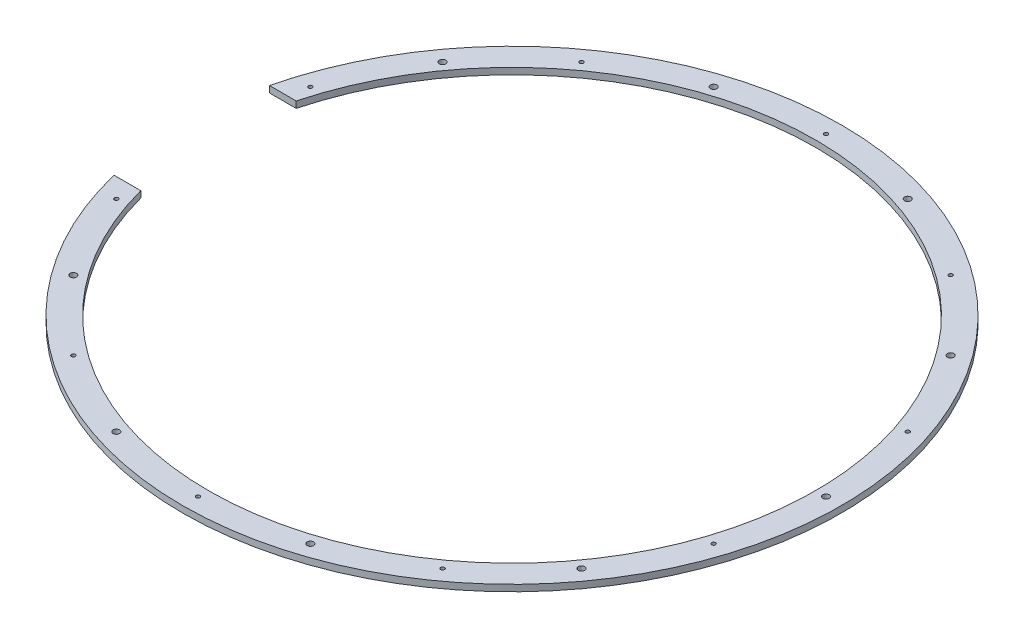
ISO-10303-21;
HEADER;
FILE_DESCRIPTION(('STEP AP214'),'2;1');
FILE_NAME('part.step','',(''),(''),'','','');
FILE_SCHEMA(('AUTOMOTIVE_DESIGN { 1 0 10303 214 1 1 1 1 }'));
ENDSEC;
DATA;
#1=APPLICATION_CONTEXT('core data for automotive mechanical design processes');
#2=APPLICATION_PROTOCOL_DEFINITION('international standard','automotive_design',2000,#1);
#3=PRODUCT_CONTEXT('',#1,'mechanical');
#4=PRODUCT('Part','Part','',(#3));
#5=PRODUCT_RELATED_PRODUCT_CATEGORY('part','',(#4));
#6=PRODUCT_DEFINITION_FORMATION('','',#4);
#7=PRODUCT_DEFINITION_CONTEXT('part definition',#1,'design');
#8=PRODUCT_DEFINITION('design','',#6,#7);
#9=PRODUCT_DEFINITION_SHAPE('','',#8);
#10=(LENGTH_UNIT() NAMED_UNIT(*) SI_UNIT(.MILLI.,.METRE.));
#11=(NAMED_UNIT(*) PLANE_ANGLE_UNIT() SI_UNIT($,.RADIAN.));
#12=(NAMED_UNIT(*) SI_UNIT($,.STERADIAN.) SOLID_ANGLE_UNIT());
#13=UNCERTAINTY_MEASURE_WITH_UNIT(LENGTH_MEASURE(1.E-05),#10,'distance_accuracy_value','');
#14=(GEOMETRIC_REPRESENTATION_CONTEXT(3) GLOBAL_UNCERTAINTY_ASSIGNED_CONTEXT((#13)) GLOBAL_UNIT_ASSIGNED_CONTEXT((#10,
#11,#12)) REPRESENTATION_CONTEXT('',''));
#15=CARTESIAN_POINT('',(0.,0.,0.));
#16=DIRECTION('',(0.,0.,1.));
#17=DIRECTION('',(1.,0.,0.));
#18=AXIS2_PLACEMENT_3D('',#15,#16,#17);
#19=CARTESIAN_POINT('',(0.,5.,0.));
#20=DIRECTION('',(0.,1.,0.));
#21=DIRECTION('',(0.,0.,1.));
#22=AXIS2_PLACEMENT_3D('',#19,#20,#21);
#23=PLANE('',#22);
#24=CARTESIAN_POINT('',(1.32132478297511E-11,5.,242.50000000001));
#25=DIRECTION('',(0.,1.,0.));
#26=DIRECTION('',(0.,0.,1.));
#27=AXIS2_PLACEMENT_3D('',#24,#25,#26);
#28=CIRCLE('',#27,1.49999999999059);
#29=CARTESIAN_POINT('',(1.32132478297511E-11,5.,244.));
#30=VERTEX_POINT('',#29);
#31=EDGE_CURVE('E205',#30,#30,#28,.T.);
#32=ORIENTED_EDGE('',*,*,#31,.F.);
#33=EDGE_LOOP('',(#32));
#34=FACE_BOUND('',#33,.T.);
#35=CARTESIAN_POINT('',(142.537923680936,5.,196.186621135929));
#36=DIRECTION('',(0.,1.,0.));
#37=DIRECTION('',(0.,0.,1.));
#38=AXIS2_PLACEMENT_3D('',#35,#36,#37);
#39=CIRCLE('',#38,1.4999999999906);
#40=CARTESIAN_POINT('',(142.537923680936,5.,197.686621135919));
#41=VERTEX_POINT('',#40);
#42=EDGE_CURVE('E160',#41,#41,#39,.T.);
#43=ORIENTED_EDGE('',*,*,#42,.F.);
#44=EDGE_LOOP('',(#43));
#45=FACE_BOUND('',#44,.T.);
#46=CARTESIAN_POINT('',(230.631205201581,5.,74.9366211359248));
#47=DIRECTION('',(0.,1.,0.));
#48=DIRECTION('',(0.,0.,1.));
#49=AXIS2_PLACEMENT_3D('',#46,#47,#48);
#50=CIRCLE('',#49,1.49999999999414);
#51=CARTESIAN_POINT('',(230.631205201581,5.,76.4366211359189));
#52=VERTEX_POINT('',#51);
#53=EDGE_CURVE('E159',#52,#52,#50,.T.);
#54=ORIENTED_EDGE('',*,*,#53,.F.);
#55=EDGE_LOOP('',(#54));
#56=FACE_BOUND('',#55,.T.);
#57=CARTESIAN_POINT('',(230.631205201575,5.,-74.9366211359248));
#58=DIRECTION('',(0.,1.,0.));
#59=DIRECTION('',(0.,0.,1.));
#60=AXIS2_PLACEMENT_3D('',#57,#58,#59);
#61=CIRCLE('',#60,1.5);
#62=CARTESIAN_POINT('',(230.631205201575,5.,-73.4366211359248));
#63=VERTEX_POINT('',#62);
#64=EDGE_CURVE('E166',#63,#63,#61,.T.);
#65=ORIENTED_EDGE('',*,*,#64,.F.);
#66=EDGE_LOOP('',(#65));
#67=FACE_BOUND('',#66,.T.);
#68=CARTESIAN_POINT('',(142.53792368092,5.,-196.186621135921));
#69=DIRECTION('',(0.,1.,0.));
#70=DIRECTION('',(0.,0.,1.));
#71=AXIS2_PLACEMENT_3D('',#68,#69,#70);
#72=CIRCLE('',#71,1.50000000000597);
#73=CARTESIAN_POINT('',(142.53792368092,5.,-194.686621135915));
#74=VERTEX_POINT('',#73);
#75=EDGE_CURVE('E172',#74,#74,#72,.T.);
#76=ORIENTED_EDGE('',*,*,#75,.F.);
#77=EDGE_LOOP('',(#76));
#78=FACE_BOUND('',#77,.T.);
#79=CARTESIAN_POINT('',(-7.07926561869708E-12,5.,-242.499999999991));
#80=DIRECTION('',(0.,1.,0.));
#81=DIRECTION('',(0.,0.,1.));
#82=AXIS2_PLACEMENT_3D('',#79,#80,#81);
#83=CIRCLE('',#82,1.50000000000972);
#84=CARTESIAN_POINT('',(-7.07926561869708E-12,5.,-240.999999999981));
#85=VERTEX_POINT('',#84);
#86=EDGE_CURVE('E178',#85,#85,#83,.T.);
#87=ORIENTED_EDGE('',*,*,#86,.F.);
#88=EDGE_LOOP('',(#87));
#89=FACE_BOUND('',#88,.T.);
#90=CARTESIAN_POINT('',(-142.53792368093,5.,-196.186621135909));
#91=DIRECTION('',(0.,1.,0.));
#92=DIRECTION('',(0.,0.,1.));
#93=AXIS2_PLACEMENT_3D('',#90,#91,#92);
#94=CIRCLE('',#93,1.50000000000975);
#95=CARTESIAN_POINT('',(-142.53792368093,5.,-194.6866211359));
#96=VERTEX_POINT('',#95);
#97=EDGE_CURVE('E184',#96,#96,#94,.T.);
#98=ORIENTED_EDGE('',*,*,#97,.F.);
#99=EDGE_LOOP('',(#98));
#100=FACE_BOUND('',#99,.T.);
#101=CARTESIAN_POINT('',(-230.631205201575,5.,-74.9366211359056));
#102=DIRECTION('',(0.,1.,0.));
#103=DIRECTION('',(0.,0.,1.));
#104=AXIS2_PLACEMENT_3D('',#101,#102,#103);
#105=CIRCLE('',#104,1.50000000000615);
#106=CARTESIAN_POINT('',(-230.631205201575,5.,-73.4366211358995));
#107=VERTEX_POINT('',#106);
#108=EDGE_CURVE('E190',#107,#107,#105,.T.);
#109=ORIENTED_EDGE('',*,*,#108,.F.);
#110=EDGE_LOOP('',(#109));
#111=FACE_BOUND('',#110,.T.);
#112=CARTESIAN_POINT('',(-230.631205201569,5.,74.936621135944));
#113=DIRECTION('',(0.,1.,0.));
#114=DIRECTION('',(0.,0.,1.));
#115=AXIS2_PLACEMENT_3D('',#112,#113,#114);
#116=CIRCLE('',#115,1.50000000000033);
#117=CARTESIAN_POINT('',(-230.631205201569,5.,76.4366211359443));
#118=VERTEX_POINT('',#117);
#119=EDGE_CURVE('E196',#118,#118,#116,.T.);
#120=ORIENTED_EDGE('',*,*,#119,.F.);
#121=EDGE_LOOP('',(#120));
#122=FACE_BOUND('',#121,.T.);
#123=CARTESIAN_POINT('',(-142.537923680914,5.,196.18662113594));
#124=DIRECTION('',(0.,1.,0.));
#125=DIRECTION('',(0.,0.,1.));
#126=AXIS2_PLACEMENT_3D('',#123,#124,#125);
#127=CIRCLE('',#126,1.49999999999442);
#128=CARTESIAN_POINT('',(-142.537923680914,5.,197.686621135935));
#129=VERTEX_POINT('',#128);
#130=EDGE_CURVE('E202',#129,#129,#127,.T.);
#131=ORIENTED_EDGE('',*,*,#130,.F.);
#132=EDGE_LOOP('',(#131));
#133=FACE_BOUND('',#132,.T.);
#134=CARTESIAN_POINT('',(242.5,5.,0.));
#135=DIRECTION('',(0.,1.,0.));
#136=DIRECTION('',(0.,0.,1.));
#137=AXIS2_PLACEMENT_3D('',#134,#135,#136);
#138=CIRCLE('',#137,2.5);
#139=CARTESIAN_POINT('',(242.5,5.,2.5));
#140=VERTEX_POINT('',#139);
#141=EDGE_CURVE('E145',#140,#140,#138,.T.);
#142=ORIENTED_EDGE('',*,*,#141,.F.);
#143=EDGE_LOOP('',(#142));
#144=FACE_BOUND('',#143,.T.);
#145=CARTESIAN_POINT('',(196.186621135925,5.,-142.537923680925));
#146=DIRECTION('',(0.,1.,0.));
#147=DIRECTION('',(0.,0.,1.));
#148=AXIS2_PLACEMENT_3D('',#145,#146,#147);
#149=CIRCLE('',#148,2.5);
#150=CARTESIAN_POINT('',(196.186621135925,5.,-140.037923680925));
#151=VERTEX_POINT('',#150);
#152=EDGE_CURVE('E146',#151,#151,#149,.T.);
#153=ORIENTED_EDGE('',*,*,#152,.F.);
#154=EDGE_LOOP('',(#153));
#155=FACE_BOUND('',#154,.T.);
#156=CARTESIAN_POINT('',(74.9366211359247,5.,-230.631205201575));
#157=DIRECTION('',(0.,1.,0.));
#158=DIRECTION('',(0.,0.,1.));
#159=AXIS2_PLACEMENT_3D('',#156,#157,#158);
#160=CIRCLE('',#159,2.50000000000001);
#161=CARTESIAN_POINT('',(74.9366211359247,5.,-228.131205201575));
#162=VERTEX_POINT('',#161);
#163=EDGE_CURVE('E102',#162,#162,#160,.T.);
#164=ORIENTED_EDGE('',*,*,#163,.F.);
#165=EDGE_LOOP('',(#164));
#166=FACE_BOUND('',#165,.T.);
#167=CARTESIAN_POINT('',(-74.9366211359248,5.,-230.631205201575));
#168=DIRECTION('',(0.,1.,0.));
#169=DIRECTION('',(0.,0.,1.));
#170=AXIS2_PLACEMENT_3D('',#167,#168,#169);
#171=CIRCLE('',#170,2.5);
#172=CARTESIAN_POINT('',(-74.9366211359248,5.,-228.131205201575));
#173=VERTEX_POINT('',#172);
#174=EDGE_CURVE('E109',#173,#173,#171,.T.);
#175=ORIENTED_EDGE('',*,*,#174,.F.);
#176=EDGE_LOOP('',(#175));
#177=FACE_BOUND('',#176,.T.);
#178=CARTESIAN_POINT('',(-196.186621135925,5.,-142.537923680925));
#179=DIRECTION('',(0.,1.,0.));
#180=DIRECTION('',(0.,0.,1.));
#181=AXIS2_PLACEMENT_3D('',#178,#179,#180);
#182=CIRCLE('',#181,2.5);
#183=CARTESIAN_POINT('',(-196.186621135925,5.,-140.037923680925));
#184=VERTEX_POINT('',#183);
#185=EDGE_CURVE('E115',#184,#184,#182,.T.);
#186=ORIENTED_EDGE('',*,*,#185,.F.);
#187=EDGE_LOOP('',(#186));
#188=FACE_BOUND('',#187,.T.);
#189=CARTESIAN_POINT('',(-196.186621135925,5.,142.537923680925));
#190=DIRECTION('',(0.,1.,0.));
#191=DIRECTION('',(0.,0.,1.));
#192=AXIS2_PLACEMENT_3D('',#189,#190,#191);
#193=CIRCLE('',#192,2.5);
#194=CARTESIAN_POINT('',(-196.186621135925,5.,145.037923680925));
#195=VERTEX_POINT('',#194);
#196=EDGE_CURVE('E121',#195,#195,#193,.T.);
#197=ORIENTED_EDGE('',*,*,#196,.F.);
#198=EDGE_LOOP('',(#197));
#199=FACE_BOUND('',#198,.T.);
#200=CARTESIAN_POINT('',(-74.9366211359248,5.,230.631205201575));
#201=DIRECTION('',(0.,1.,0.));
#202=DIRECTION('',(0.,0.,1.));
#203=AXIS2_PLACEMENT_3D('',#200,#201,#202);
#204=CIRCLE('',#203,2.5);
#205=CARTESIAN_POINT('',(-74.9366211359248,5.,233.131205201575));
#206=VERTEX_POINT('',#205);
#207=EDGE_CURVE('E127',#206,#206,#204,.T.);
#208=ORIENTED_EDGE('',*,*,#207,.F.);
#209=EDGE_LOOP('',(#208));
#210=FACE_BOUND('',#209,.T.);
#211=CARTESIAN_POINT('',(74.9366211359247,5.,230.631205201575));
#212=DIRECTION('',(0.,1.,0.));
#213=DIRECTION('',(0.,0.,1.));
#214=AXIS2_PLACEMENT_3D('',#211,#212,#213);
#215=CIRCLE('',#214,2.49999999999998);
#216=CARTESIAN_POINT('',(74.9366211359247,5.,233.131205201575));
#217=VERTEX_POINT('',#216);
#218=EDGE_CURVE('E133',#217,#217,#215,.T.);
#219=ORIENTED_EDGE('',*,*,#218,.F.);
#220=EDGE_LOOP('',(#219));
#221=FACE_BOUND('',#220,.T.);
#222=CARTESIAN_POINT('',(196.186621135925,5.,142.537923680925));
#223=DIRECTION('',(0.,1.,0.));
#224=DIRECTION('',(0.,0.,1.));
#225=AXIS2_PLACEMENT_3D('',#222,#223,#224);
#226=CIRCLE('',#225,2.50000000000002);
#227=CARTESIAN_POINT('',(196.186621135925,5.,145.037923680925));
#228=VERTEX_POINT('',#227);
#229=EDGE_CURVE('E139',#228,#228,#226,.T.);
#230=ORIENTED_EDGE('',*,*,#229,.F.);
#231=EDGE_LOOP('',(#230));
#232=FACE_BOUND('',#231,.T.);
#233=CARTESIAN_POINT('',(0.,5.,0.));
#234=DIRECTION('',(0.,1.,0.));
#235=DIRECTION('',(0.,0.,1.));
#236=AXIS2_PLACEMENT_3D('',#233,#234,#235);
#237=CIRCLE('',#236,234.5);
#238=CARTESIAN_POINT('',(-226.694177252086,5.,60.));
#239=VERTEX_POINT('',#238);
#240=CARTESIAN_POINT('',(-226.694177252086,5.,-60.));
#241=VERTEX_POINT('',#240);
#242=EDGE_CURVE('E86',#239,#241,#237,.T.);
#243=ORIENTED_EDGE('',*,*,#242,.F.);
#244=DIRECTION('',(-1.,0.,0.));
#245=VECTOR('',#244,1.);
#246=CARTESIAN_POINT('',(-226.694177252086,5.,60.));
#247=LINE('',#246,#245);
#248=CARTESIAN_POINT('',(-247.326201604278,5.,60.));
#249=VERTEX_POINT('',#248);
#250=EDGE_CURVE('E47',#239,#249,#247,.T.);
#251=ORIENTED_EDGE('',*,*,#250,.T.);
#252=CARTESIAN_POINT('',(0.,5.,0.));
#253=DIRECTION('',(0.,1.,0.));
#254=DIRECTION('',(0.,0.,1.));
#255=AXIS2_PLACEMENT_3D('',#252,#253,#254);
#256=CIRCLE('',#255,254.5);
#257=CARTESIAN_POINT('',(-247.326201604278,5.,-60.));
#258=VERTEX_POINT('',#257);
#259=EDGE_CURVE('E11',#249,#258,#256,.T.);
#260=ORIENTED_EDGE('',*,*,#259,.T.);
#261=DIRECTION('',(-1.,0.,0.));
#262=VECTOR('',#261,1.);
#263=CARTESIAN_POINT('',(-226.694177252086,5.,-60.));
#264=LINE('',#263,#262);
#265=EDGE_CURVE('E95',#241,#258,#264,.T.);
#266=ORIENTED_EDGE('',*,*,#265,.F.);
#267=EDGE_LOOP('',(#243,#251,#260,#266));
#268=FACE_BOUND('',#267,.T.);
#269=ADVANCED_FACE('F32',(#34,#45,#56,#67,#78,#89,#100,#111,#122,#133,#144,#155,#166,#177,#188,
#199,#210,#221,#232,#268),#23,.T.);
#270=CARTESIAN_POINT('',(0.,0.,0.));
#271=DIRECTION('',(0.,1.,0.));
#272=DIRECTION('',(0.,0.,1.));
#273=AXIS2_PLACEMENT_3D('',#270,#271,#272);
#274=PLANE('',#273);
#275=CARTESIAN_POINT('',(1.32132478297511E-11,0.,242.50000000001));
#276=DIRECTION('',(0.,1.,0.));
#277=DIRECTION('',(0.,0.,1.));
#278=AXIS2_PLACEMENT_3D('',#275,#276,#277);
#279=CIRCLE('',#278,1.49999999999059);
#280=CARTESIAN_POINT('',(1.32132478297511E-11,0.,244.));
#281=VERTEX_POINT('',#280);
#282=EDGE_CURVE('E149',#281,#281,#279,.T.);
#283=ORIENTED_EDGE('',*,*,#282,.T.);
#284=EDGE_LOOP('',(#283));
#285=FACE_BOUND('',#284,.T.);
#286=CARTESIAN_POINT('',(142.537923680936,0.,196.186621135929));
#287=DIRECTION('',(0.,1.,0.));
#288=DIRECTION('',(0.,0.,1.));
#289=AXIS2_PLACEMENT_3D('',#286,#287,#288);
#290=CIRCLE('',#289,1.4999999999906);
#291=CARTESIAN_POINT('',(142.537923680936,0.,197.686621135919));
#292=VERTEX_POINT('',#291);
#293=EDGE_CURVE('E206',#292,#292,#290,.T.);
#294=ORIENTED_EDGE('',*,*,#293,.T.);
#295=EDGE_LOOP('',(#294));
#296=FACE_BOUND('',#295,.T.);
#297=CARTESIAN_POINT('',(230.631205201581,0.,74.9366211359248));
#298=DIRECTION('',(0.,1.,0.));
#299=DIRECTION('',(0.,0.,1.));
#300=AXIS2_PLACEMENT_3D('',#297,#298,#299);
#301=CIRCLE('',#300,1.49999999999414);
#302=CARTESIAN_POINT('',(230.631205201581,0.,76.4366211359189));
#303=VERTEX_POINT('',#302);
#304=EDGE_CURVE('E156',#303,#303,#301,.T.);
#305=ORIENTED_EDGE('',*,*,#304,.T.);
#306=EDGE_LOOP('',(#305));
#307=FACE_BOUND('',#306,.T.);
#308=CARTESIAN_POINT('',(230.631205201575,0.,-74.9366211359248));
#309=DIRECTION('',(0.,1.,0.));
#310=DIRECTION('',(0.,0.,1.));
#311=AXIS2_PLACEMENT_3D('',#308,#309,#310);
#312=CIRCLE('',#311,1.5);
#313=CARTESIAN_POINT('',(230.631205201575,0.,-73.4366211359248));
#314=VERTEX_POINT('',#313);
#315=EDGE_CURVE('E163',#314,#314,#312,.T.);
#316=ORIENTED_EDGE('',*,*,#315,.T.);
#317=EDGE_LOOP('',(#316));
#318=FACE_BOUND('',#317,.T.);
#319=CARTESIAN_POINT('',(142.53792368092,0.,-196.186621135921));
#320=DIRECTION('',(0.,1.,0.));
#321=DIRECTION('',(0.,0.,1.));
#322=AXIS2_PLACEMENT_3D('',#319,#320,#321);
#323=CIRCLE('',#322,1.50000000000597);
#324=CARTESIAN_POINT('',(142.53792368092,0.,-194.686621135915));
#325=VERTEX_POINT('',#324);
#326=EDGE_CURVE('E169',#325,#325,#323,.T.);
#327=ORIENTED_EDGE('',*,*,#326,.T.);
#328=EDGE_LOOP('',(#327));
#329=FACE_BOUND('',#328,.T.);
#330=CARTESIAN_POINT('',(-7.07926561869708E-12,0.,-242.499999999991));
#331=DIRECTION('',(0.,1.,0.));
#332=DIRECTION('',(0.,0.,1.));
#333=AXIS2_PLACEMENT_3D('',#330,#331,#332);
#334=CIRCLE('',#333,1.50000000000972);
#335=CARTESIAN_POINT('',(-7.07926561869708E-12,0.,-240.999999999981));
#336=VERTEX_POINT('',#335);
#337=EDGE_CURVE('E175',#336,#336,#334,.T.);
#338=ORIENTED_EDGE('',*,*,#337,.T.);
#339=EDGE_LOOP('',(#338));
#340=FACE_BOUND('',#339,.T.);
#341=CARTESIAN_POINT('',(-142.53792368093,0.,-196.186621135909));
#342=DIRECTION('',(0.,1.,0.));
#343=DIRECTION('',(0.,0.,1.));
#344=AXIS2_PLACEMENT_3D('',#341,#342,#343);
#345=CIRCLE('',#344,1.50000000000975);
#346=CARTESIAN_POINT('',(-142.53792368093,0.,-194.6866211359));
#347=VERTEX_POINT('',#346);
#348=EDGE_CURVE('E181',#347,#347,#345,.T.);
#349=ORIENTED_EDGE('',*,*,#348,.T.);
#350=EDGE_LOOP('',(#349));
#351=FACE_BOUND('',#350,.T.);
#352=CARTESIAN_POINT('',(-230.631205201575,0.,-74.9366211359056));
#353=DIRECTION('',(0.,1.,0.));
#354=DIRECTION('',(0.,0.,1.));
#355=AXIS2_PLACEMENT_3D('',#352,#353,#354);
#356=CIRCLE('',#355,1.50000000000615);
#357=CARTESIAN_POINT('',(-230.631205201575,0.,-73.4366211358995));
#358=VERTEX_POINT('',#357);
#359=EDGE_CURVE('E187',#358,#358,#356,.T.);
#360=ORIENTED_EDGE('',*,*,#359,.T.);
#361=EDGE_LOOP('',(#360));
#362=FACE_BOUND('',#361,.T.);
#363=CARTESIAN_POINT('',(-230.631205201569,0.,74.936621135944));
#364=DIRECTION('',(0.,1.,0.));
#365=DIRECTION('',(0.,0.,1.));
#366=AXIS2_PLACEMENT_3D('',#363,#364,#365);
#367=CIRCLE('',#366,1.50000000000033);
#368=CARTESIAN_POINT('',(-230.631205201569,0.,76.4366211359443));
#369=VERTEX_POINT('',#368);
#370=EDGE_CURVE('E193',#369,#369,#367,.T.);
#371=ORIENTED_EDGE('',*,*,#370,.T.);
#372=EDGE_LOOP('',(#371));
#373=FACE_BOUND('',#372,.T.);
#374=CARTESIAN_POINT('',(-142.537923680914,0.,196.18662113594));
#375=DIRECTION('',(0.,1.,0.));
#376=DIRECTION('',(0.,0.,1.));
#377=AXIS2_PLACEMENT_3D('',#374,#375,#376);
#378=CIRCLE('',#377,1.49999999999442);
#379=CARTESIAN_POINT('',(-142.537923680914,0.,197.686621135935));
#380=VERTEX_POINT('',#379);
#381=EDGE_CURVE('E199',#380,#380,#378,.T.);
#382=ORIENTED_EDGE('',*,*,#381,.T.);
#383=EDGE_LOOP('',(#382));
#384=FACE_BOUND('',#383,.T.);
#385=CARTESIAN_POINT('',(242.5,0.,0.));
#386=DIRECTION('',(0.,1.,0.));
#387=DIRECTION('',(0.,0.,1.));
#388=AXIS2_PLACEMENT_3D('',#385,#386,#387);
#389=CIRCLE('',#388,2.5);
#390=CARTESIAN_POINT('',(242.5,0.,2.5));
#391=VERTEX_POINT('',#390);
#392=EDGE_CURVE('E100',#391,#391,#389,.T.);
#393=ORIENTED_EDGE('',*,*,#392,.T.);
#394=EDGE_LOOP('',(#393));
#395=FACE_BOUND('',#394,.T.);
#396=CARTESIAN_POINT('',(196.186621135925,0.,-142.537923680925));
#397=DIRECTION('',(0.,1.,0.));
#398=DIRECTION('',(0.,0.,1.));
#399=AXIS2_PLACEMENT_3D('',#396,#397,#398);
#400=CIRCLE('',#399,2.5);
#401=CARTESIAN_POINT('',(196.186621135925,0.,-140.037923680925));
#402=VERTEX_POINT('',#401);
#403=EDGE_CURVE('E106',#402,#402,#400,.T.);
#404=ORIENTED_EDGE('',*,*,#403,.T.);
#405=EDGE_LOOP('',(#404));
#406=FACE_BOUND('',#405,.T.);
#407=CARTESIAN_POINT('',(74.9366211359247,0.,-230.631205201575));
#408=DIRECTION('',(0.,1.,0.));
#409=DIRECTION('',(0.,0.,1.));
#410=AXIS2_PLACEMENT_3D('',#407,#408,#409);
#411=CIRCLE('',#410,2.50000000000001);
#412=CARTESIAN_POINT('',(74.9366211359247,0.,-228.131205201575));
#413=VERTEX_POINT('',#412);
#414=EDGE_CURVE('E105',#413,#413,#411,.T.);
#415=ORIENTED_EDGE('',*,*,#414,.T.);
#416=EDGE_LOOP('',(#415));
#417=FACE_BOUND('',#416,.T.);
#418=CARTESIAN_POINT('',(-74.9366211359248,0.,-230.631205201575));
#419=DIRECTION('',(0.,1.,0.));
#420=DIRECTION('',(0.,0.,1.));
#421=AXIS2_PLACEMENT_3D('',#418,#419,#420);
#422=CIRCLE('',#421,2.5);
#423=CARTESIAN_POINT('',(-74.9366211359248,0.,-228.131205201575));
#424=VERTEX_POINT('',#423);
#425=EDGE_CURVE('E112',#424,#424,#422,.T.);
#426=ORIENTED_EDGE('',*,*,#425,.T.);
#427=EDGE_LOOP('',(#426));
#428=FACE_BOUND('',#427,.T.);
#429=CARTESIAN_POINT('',(-196.186621135925,0.,-142.537923680925));
#430=DIRECTION('',(0.,1.,0.));
#431=DIRECTION('',(0.,0.,1.));
#432=AXIS2_PLACEMENT_3D('',#429,#430,#431);
#433=CIRCLE('',#432,2.5);
#434=CARTESIAN_POINT('',(-196.186621135925,0.,-140.037923680925));
#435=VERTEX_POINT('',#434);
#436=EDGE_CURVE('E118',#435,#435,#433,.T.);
#437=ORIENTED_EDGE('',*,*,#436,.T.);
#438=EDGE_LOOP('',(#437));
#439=FACE_BOUND('',#438,.T.);
#440=CARTESIAN_POINT('',(-196.186621135925,0.,142.537923680925));
#441=DIRECTION('',(0.,1.,0.));
#442=DIRECTION('',(0.,0.,1.));
#443=AXIS2_PLACEMENT_3D('',#440,#441,#442);
#444=CIRCLE('',#443,2.5);
#445=CARTESIAN_POINT('',(-196.186621135925,0.,145.037923680925));
#446=VERTEX_POINT('',#445);
#447=EDGE_CURVE('E124',#446,#446,#444,.T.);
#448=ORIENTED_EDGE('',*,*,#447,.T.);
#449=EDGE_LOOP('',(#448));
#450=FACE_BOUND('',#449,.T.);
#451=CARTESIAN_POINT('',(-74.9366211359248,0.,230.631205201575));
#452=DIRECTION('',(0.,1.,0.));
#453=DIRECTION('',(0.,0.,1.));
#454=AXIS2_PLACEMENT_3D('',#451,#452,#453);
#455=CIRCLE('',#454,2.5);
#456=CARTESIAN_POINT('',(-74.9366211359248,0.,233.131205201575));
#457=VERTEX_POINT('',#456);
#458=EDGE_CURVE('E130',#457,#457,#455,.T.);
#459=ORIENTED_EDGE('',*,*,#458,.T.);
#460=EDGE_LOOP('',(#459));
#461=FACE_BOUND('',#460,.T.);
#462=CARTESIAN_POINT('',(74.9366211359247,0.,230.631205201575));
#463=DIRECTION('',(0.,1.,0.));
#464=DIRECTION('',(0.,0.,1.));
#465=AXIS2_PLACEMENT_3D('',#462,#463,#464);
#466=CIRCLE('',#465,2.49999999999998);
#467=CARTESIAN_POINT('',(74.9366211359247,0.,233.131205201575));
#468=VERTEX_POINT('',#467);
#469=EDGE_CURVE('E136',#468,#468,#466,.T.);
#470=ORIENTED_EDGE('',*,*,#469,.T.);
#471=EDGE_LOOP('',(#470));
#472=FACE_BOUND('',#471,.T.);
#473=CARTESIAN_POINT('',(196.186621135925,0.,142.537923680925));
#474=DIRECTION('',(0.,1.,0.));
#475=DIRECTION('',(0.,0.,1.));
#476=AXIS2_PLACEMENT_3D('',#473,#474,#475);
#477=CIRCLE('',#476,2.50000000000002);
#478=CARTESIAN_POINT('',(196.186621135925,0.,145.037923680925));
#479=VERTEX_POINT('',#478);
#480=EDGE_CURVE('E142',#479,#479,#477,.T.);
#481=ORIENTED_EDGE('',*,*,#480,.T.);
#482=EDGE_LOOP('',(#481));
#483=FACE_BOUND('',#482,.T.);
#484=DIRECTION('',(-1.,0.,0.));
#485=VECTOR('',#484,1.);
#486=CARTESIAN_POINT('',(-226.694177252086,0.,60.));
#487=LINE('',#486,#485);
#488=CARTESIAN_POINT('',(-226.694177252086,0.,60.));
#489=VERTEX_POINT('',#488);
#490=CARTESIAN_POINT('',(-247.326201604278,0.,60.));
#491=VERTEX_POINT('',#490);
#492=EDGE_CURVE('E73',#489,#491,#487,.T.);
#493=ORIENTED_EDGE('',*,*,#492,.F.);
#494=CARTESIAN_POINT('',(0.,0.,0.));
#495=DIRECTION('',(0.,1.,0.));
#496=DIRECTION('',(0.,0.,1.));
#497=AXIS2_PLACEMENT_3D('',#494,#495,#496);
#498=CIRCLE('',#497,234.5);
#499=CARTESIAN_POINT('',(-226.694177252086,0.,-60.));
#500=VERTEX_POINT('',#499);
#501=EDGE_CURVE('E55',#489,#500,#498,.T.);
#502=ORIENTED_EDGE('',*,*,#501,.T.);
#503=DIRECTION('',(-1.,0.,0.));
#504=VECTOR('',#503,1.);
#505=CARTESIAN_POINT('',(-226.694177252086,0.,-60.));
#506=LINE('',#505,#504);
#507=CARTESIAN_POINT('',(-247.326201604278,0.,-60.));
#508=VERTEX_POINT('',#507);
#509=EDGE_CURVE('E94',#500,#508,#506,.T.);
#510=ORIENTED_EDGE('',*,*,#509,.T.);
#511=CARTESIAN_POINT('',(0.,0.,0.));
#512=DIRECTION('',(0.,1.,0.));
#513=DIRECTION('',(0.,0.,1.));
#514=AXIS2_PLACEMENT_3D('',#511,#512,#513);
#515=CIRCLE('',#514,254.5);
#516=EDGE_CURVE('E36',#491,#508,#515,.T.);
#517=ORIENTED_EDGE('',*,*,#516,.F.);
#518=EDGE_LOOP('',(#493,#502,#510,#517));
#519=FACE_BOUND('',#518,.T.);
#520=ADVANCED_FACE('F80',(#285,#296,#307,#318,#329,#340,#351,#362,#373,#384,#395,#406,#417,#428,
#439,#450,#461,#472,#483,#519),#274,.F.);
#521=CARTESIAN_POINT('',(0.,5.,0.));
#522=DIRECTION('',(0.,-1.,0.));
#523=DIRECTION('',(0.,0.,-1.));
#524=AXIS2_PLACEMENT_3D('',#521,#522,#523);
#525=CYLINDRICAL_SURFACE('',#524,254.5);
#526=DIRECTION('',(0.,-1.,0.));
#527=VECTOR('',#526,1.);
#528=CARTESIAN_POINT('',(-247.326201604278,5.,60.));
#529=LINE('',#528,#527);
#530=EDGE_CURVE('E77',#491,#249,#529,.F.);
#531=ORIENTED_EDGE('',*,*,#530,.F.);
#532=ORIENTED_EDGE('',*,*,#516,.T.);
#533=DIRECTION('',(0.,-1.,0.));
#534=VECTOR('',#533,1.);
#535=CARTESIAN_POINT('',(-247.326201604278,5.,-60.));
#536=LINE('',#535,#534);
#537=EDGE_CURVE('E87',#508,#258,#536,.F.);
#538=ORIENTED_EDGE('',*,*,#537,.T.);
#539=ORIENTED_EDGE('',*,*,#259,.F.);
#540=EDGE_LOOP('',(#531,#532,#538,#539));
#541=FACE_BOUND('',#540,.T.);
#542=ADVANCED_FACE('F34',(#541),#525,.T.);
#543=CARTESIAN_POINT('',(0.,5.,0.));
#544=DIRECTION('',(0.,-1.,0.));
#545=DIRECTION('',(0.,0.,-1.));
#546=AXIS2_PLACEMENT_3D('',#543,#544,#545);
#547=CYLINDRICAL_SURFACE('',#546,234.5);
#548=ORIENTED_EDGE('',*,*,#501,.F.);
#549=DIRECTION('',(0.,1.,0.));
#550=VECTOR('',#549,1.);
#551=CARTESIAN_POINT('',(-226.694177252086,0.,60.));
#552=LINE('',#551,#550);
#553=EDGE_CURVE('E71',#489,#239,#552,.T.);
#554=ORIENTED_EDGE('',*,*,#553,.T.);
#555=ORIENTED_EDGE('',*,*,#242,.T.);
#556=DIRECTION('',(0.,1.,0.));
#557=VECTOR('',#556,1.);
#558=CARTESIAN_POINT('',(-226.694177252086,0.,-60.));
#559=LINE('',#558,#557);
#560=EDGE_CURVE('E85',#500,#241,#559,.T.);
#561=ORIENTED_EDGE('',*,*,#560,.F.);
#562=EDGE_LOOP('',(#548,#554,#555,#561));
#563=FACE_BOUND('',#562,.T.);
#564=ADVANCED_FACE('F83',(#563),#547,.F.);
#565=CARTESIAN_POINT('',(-226.694177252086,0.,-60.));
#566=DIRECTION('',(0.,0.,-1.));
#567=DIRECTION('',(-1.,0.,0.));
#568=AXIS2_PLACEMENT_3D('',#565,#566,#567);
#569=PLANE('',#568);
#570=ORIENTED_EDGE('',*,*,#509,.F.);
#571=ORIENTED_EDGE('',*,*,#560,.T.);
#572=ORIENTED_EDGE('',*,*,#265,.T.);
#573=ORIENTED_EDGE('',*,*,#537,.F.);
#574=EDGE_LOOP('',(#570,#571,#572,#573));
#575=FACE_BOUND('',#574,.T.);
#576=ADVANCED_FACE('F267',(#575),#569,.F.);
#577=CARTESIAN_POINT('',(-226.694177252086,0.,60.));
#578=DIRECTION('',(0.,0.,-1.));
#579=DIRECTION('',(-1.,0.,0.));
#580=AXIS2_PLACEMENT_3D('',#577,#578,#579);
#581=PLANE('',#580);
#582=ORIENTED_EDGE('',*,*,#530,.T.);
#583=ORIENTED_EDGE('',*,*,#250,.F.);
#584=ORIENTED_EDGE('',*,*,#553,.F.);
#585=ORIENTED_EDGE('',*,*,#492,.T.);
#586=EDGE_LOOP('',(#582,#583,#584,#585));
#587=FACE_BOUND('',#586,.T.);
#588=ADVANCED_FACE('F72',(#587),#581,.T.);
#589=CARTESIAN_POINT('',(196.186621135925,0.,142.537923680925));
#590=DIRECTION('',(0.,1.,0.));
#591=DIRECTION('',(0.,0.,1.));
#592=AXIS2_PLACEMENT_3D('',#589,#590,#591);
#593=CYLINDRICAL_SURFACE('',#592,2.50000000000002);
#594=ORIENTED_EDGE('',*,*,#480,.F.);
#595=EDGE_LOOP('',(#594));
#596=FACE_BOUND('',#595,.T.);
#597=ORIENTED_EDGE('',*,*,#229,.T.);
#598=EDGE_LOOP('',(#597));
#599=FACE_BOUND('',#598,.T.);
#600=ADVANCED_FACE('F283',(#596,#599),#593,.F.);
#601=CARTESIAN_POINT('',(74.9366211359247,0.,230.631205201575));
#602=DIRECTION('',(0.,1.,0.));
#603=DIRECTION('',(0.,0.,1.));
#604=AXIS2_PLACEMENT_3D('',#601,#602,#603);
#605=CYLINDRICAL_SURFACE('',#604,2.49999999999998);
#606=ORIENTED_EDGE('',*,*,#469,.F.);
#607=EDGE_LOOP('',(#606));
#608=FACE_BOUND('',#607,.T.);
#609=ORIENTED_EDGE('',*,*,#218,.T.);
#610=EDGE_LOOP('',(#609));
#611=FACE_BOUND('',#610,.T.);
#612=ADVANCED_FACE('F304',(#608,#611),#605,.F.);
#613=CARTESIAN_POINT('',(-74.9366211359248,0.,230.631205201575));
#614=DIRECTION('',(0.,1.,0.));
#615=DIRECTION('',(0.,0.,1.));
#616=AXIS2_PLACEMENT_3D('',#613,#614,#615);
#617=CYLINDRICAL_SURFACE('',#616,2.5);
#618=ORIENTED_EDGE('',*,*,#458,.F.);
#619=EDGE_LOOP('',(#618));
#620=FACE_BOUND('',#619,.T.);
#621=ORIENTED_EDGE('',*,*,#207,.T.);
#622=EDGE_LOOP('',(#621));
#623=FACE_BOUND('',#622,.T.);
#624=ADVANCED_FACE('F300',(#620,#623),#617,.F.);
#625=CARTESIAN_POINT('',(-196.186621135925,0.,142.537923680925));
#626=DIRECTION('',(0.,1.,0.));
#627=DIRECTION('',(0.,0.,1.));
#628=AXIS2_PLACEMENT_3D('',#625,#626,#627);
#629=CYLINDRICAL_SURFACE('',#628,2.5);
#630=ORIENTED_EDGE('',*,*,#447,.F.);
#631=EDGE_LOOP('',(#630));
#632=FACE_BOUND('',#631,.T.);
#633=ORIENTED_EDGE('',*,*,#196,.T.);
#634=EDGE_LOOP('',(#633));
#635=FACE_BOUND('',#634,.T.);
#636=ADVANCED_FACE('F296',(#632,#635),#629,.F.);
#637=CARTESIAN_POINT('',(-196.186621135925,0.,-142.537923680925));
#638=DIRECTION('',(0.,1.,0.));
#639=DIRECTION('',(0.,0.,1.));
#640=AXIS2_PLACEMENT_3D('',#637,#638,#639);
#641=CYLINDRICAL_SURFACE('',#640,2.5);
#642=ORIENTED_EDGE('',*,*,#436,.F.);
#643=EDGE_LOOP('',(#642));
#644=FACE_BOUND('',#643,.T.);
#645=ORIENTED_EDGE('',*,*,#185,.T.);
#646=EDGE_LOOP('',(#645));
#647=FACE_BOUND('',#646,.T.);
#648=ADVANCED_FACE('F292',(#644,#647),#641,.F.);
#649=CARTESIAN_POINT('',(-74.9366211359248,0.,-230.631205201575));
#650=DIRECTION('',(0.,1.,0.));
#651=DIRECTION('',(0.,0.,1.));
#652=AXIS2_PLACEMENT_3D('',#649,#650,#651);
#653=CYLINDRICAL_SURFACE('',#652,2.5);
#654=ORIENTED_EDGE('',*,*,#425,.F.);
#655=EDGE_LOOP('',(#654));
#656=FACE_BOUND('',#655,.T.);
#657=ORIENTED_EDGE('',*,*,#174,.T.);
#658=EDGE_LOOP('',(#657));
#659=FACE_BOUND('',#658,.T.);
#660=ADVANCED_FACE('F288',(#656,#659),#653,.F.);
#661=CARTESIAN_POINT('',(74.9366211359247,0.,-230.631205201575));
#662=DIRECTION('',(0.,1.,0.));
#663=DIRECTION('',(0.,0.,1.));
#664=AXIS2_PLACEMENT_3D('',#661,#662,#663);
#665=CYLINDRICAL_SURFACE('',#664,2.50000000000001);
#666=ORIENTED_EDGE('',*,*,#414,.F.);
#667=EDGE_LOOP('',(#666));
#668=FACE_BOUND('',#667,.T.);
#669=ORIENTED_EDGE('',*,*,#163,.T.);
#670=EDGE_LOOP('',(#669));
#671=FACE_BOUND('',#670,.T.);
#672=ADVANCED_FACE('F284',(#668,#671),#665,.F.);
#673=CARTESIAN_POINT('',(196.186621135925,0.,-142.537923680925));
#674=DIRECTION('',(0.,1.,0.));
#675=DIRECTION('',(0.,0.,1.));
#676=AXIS2_PLACEMENT_3D('',#673,#674,#675);
#677=CYLINDRICAL_SURFACE('',#676,2.5);
#678=ORIENTED_EDGE('',*,*,#403,.F.);
#679=EDGE_LOOP('',(#678));
#680=FACE_BOUND('',#679,.T.);
#681=ORIENTED_EDGE('',*,*,#152,.T.);
#682=EDGE_LOOP('',(#681));
#683=FACE_BOUND('',#682,.T.);
#684=ADVANCED_FACE('F287',(#680,#683),#677,.F.);
#685=CARTESIAN_POINT('',(242.5,0.,0.));
#686=DIRECTION('',(0.,1.,0.));
#687=DIRECTION('',(0.,0.,1.));
#688=AXIS2_PLACEMENT_3D('',#685,#686,#687);
#689=CYLINDRICAL_SURFACE('',#688,2.5);
#690=ORIENTED_EDGE('',*,*,#392,.F.);
#691=EDGE_LOOP('',(#690));
#692=FACE_BOUND('',#691,.T.);
#693=ORIENTED_EDGE('',*,*,#141,.T.);
#694=EDGE_LOOP('',(#693));
#695=FACE_BOUND('',#694,.T.);
#696=ADVANCED_FACE('F314',(#692,#695),#689,.F.);
#697=CARTESIAN_POINT('',(-142.537923680914,0.,196.18662113594));
#698=DIRECTION('',(0.,1.,0.));
#699=DIRECTION('',(0.,0.,1.));
#700=AXIS2_PLACEMENT_3D('',#697,#698,#699);
#701=CYLINDRICAL_SURFACE('',#700,1.49999999999442);
#702=ORIENTED_EDGE('',*,*,#381,.F.);
#703=EDGE_LOOP('',(#702));
#704=FACE_BOUND('',#703,.T.);
#705=ORIENTED_EDGE('',*,*,#130,.T.);
#706=EDGE_LOOP('',(#705));
#707=FACE_BOUND('',#706,.T.);
#708=ADVANCED_FACE('F318',(#704,#707),#701,.F.);
#709=CARTESIAN_POINT('',(-230.631205201569,0.,74.936621135944));
#710=DIRECTION('',(0.,1.,0.));
#711=DIRECTION('',(0.,0.,1.));
#712=AXIS2_PLACEMENT_3D('',#709,#710,#711);
#713=CYLINDRICAL_SURFACE('',#712,1.50000000000033);
#714=ORIENTED_EDGE('',*,*,#370,.F.);
#715=EDGE_LOOP('',(#714));
#716=FACE_BOUND('',#715,.T.);
#717=ORIENTED_EDGE('',*,*,#119,.T.);
#718=EDGE_LOOP('',(#717));
#719=FACE_BOUND('',#718,.T.);
#720=ADVANCED_FACE('F343',(#716,#719),#713,.F.);
#721=CARTESIAN_POINT('',(-230.631205201575,0.,-74.9366211359056));
#722=DIRECTION('',(0.,1.,0.));
#723=DIRECTION('',(0.,0.,1.));
#724=AXIS2_PLACEMENT_3D('',#721,#722,#723);
#725=CYLINDRICAL_SURFACE('',#724,1.50000000000615);
#726=ORIENTED_EDGE('',*,*,#359,.F.);
#727=EDGE_LOOP('',(#726));
#728=FACE_BOUND('',#727,.T.);
#729=ORIENTED_EDGE('',*,*,#108,.T.);
#730=EDGE_LOOP('',(#729));
#731=FACE_BOUND('',#730,.T.);
#732=ADVANCED_FACE('F339',(#728,#731),#725,.F.);
#733=CARTESIAN_POINT('',(-142.53792368093,0.,-196.186621135909));
#734=DIRECTION('',(0.,1.,0.));
#735=DIRECTION('',(0.,0.,1.));
#736=AXIS2_PLACEMENT_3D('',#733,#734,#735);
#737=CYLINDRICAL_SURFACE('',#736,1.50000000000975);
#738=ORIENTED_EDGE('',*,*,#348,.F.);
#739=EDGE_LOOP('',(#738));
#740=FACE_BOUND('',#739,.T.);
#741=ORIENTED_EDGE('',*,*,#97,.T.);
#742=EDGE_LOOP('',(#741));
#743=FACE_BOUND('',#742,.T.);
#744=ADVANCED_FACE('F335',(#740,#743),#737,.F.);
#745=CARTESIAN_POINT('',(-7.07926561869708E-12,0.,-242.499999999991));
#746=DIRECTION('',(0.,1.,0.));
#747=DIRECTION('',(0.,0.,1.));
#748=AXIS2_PLACEMENT_3D('',#745,#746,#747);
#749=CYLINDRICAL_SURFACE('',#748,1.50000000000972);
#750=ORIENTED_EDGE('',*,*,#337,.F.);
#751=EDGE_LOOP('',(#750));
#752=FACE_BOUND('',#751,.T.);
#753=ORIENTED_EDGE('',*,*,#86,.T.);
#754=EDGE_LOOP('',(#753));
#755=FACE_BOUND('',#754,.T.);
#756=ADVANCED_FACE('F331',(#752,#755),#749,.F.);
#757=CARTESIAN_POINT('',(142.53792368092,0.,-196.186621135921));
#758=DIRECTION('',(0.,1.,0.));
#759=DIRECTION('',(0.,0.,1.));
#760=AXIS2_PLACEMENT_3D('',#757,#758,#759);
#761=CYLINDRICAL_SURFACE('',#760,1.50000000000597);
#762=ORIENTED_EDGE('',*,*,#326,.F.);
#763=EDGE_LOOP('',(#762));
#764=FACE_BOUND('',#763,.T.);
#765=ORIENTED_EDGE('',*,*,#75,.T.);
#766=EDGE_LOOP('',(#765));
#767=FACE_BOUND('',#766,.T.);
#768=ADVANCED_FACE('F327',(#764,#767),#761,.F.);
#769=CARTESIAN_POINT('',(230.631205201575,0.,-74.9366211359248));
#770=DIRECTION('',(0.,1.,0.));
#771=DIRECTION('',(0.,0.,1.));
#772=AXIS2_PLACEMENT_3D('',#769,#770,#771);
#773=CYLINDRICAL_SURFACE('',#772,1.5);
#774=ORIENTED_EDGE('',*,*,#315,.F.);
#775=EDGE_LOOP('',(#774));
#776=FACE_BOUND('',#775,.T.);
#777=ORIENTED_EDGE('',*,*,#64,.T.);
#778=EDGE_LOOP('',(#777));
#779=FACE_BOUND('',#778,.T.);
#780=ADVANCED_FACE('F323',(#776,#779),#773,.F.);
#781=CARTESIAN_POINT('',(230.631205201581,0.,74.9366211359248));
#782=DIRECTION('',(0.,1.,0.));
#783=DIRECTION('',(0.,0.,1.));
#784=AXIS2_PLACEMENT_3D('',#781,#782,#783);
#785=CYLINDRICAL_SURFACE('',#784,1.49999999999414);
#786=ORIENTED_EDGE('',*,*,#304,.F.);
#787=EDGE_LOOP('',(#786));
#788=FACE_BOUND('',#787,.T.);
#789=ORIENTED_EDGE('',*,*,#53,.T.);
#790=EDGE_LOOP('',(#789));
#791=FACE_BOUND('',#790,.T.);
#792=ADVANCED_FACE('F320',(#788,#791),#785,.F.);
#793=CARTESIAN_POINT('',(142.537923680936,0.,196.186621135929));
#794=DIRECTION('',(0.,1.,0.));
#795=DIRECTION('',(0.,0.,1.));
#796=AXIS2_PLACEMENT_3D('',#793,#794,#795);
#797=CYLINDRICAL_SURFACE('',#796,1.4999999999906);
#798=ORIENTED_EDGE('',*,*,#293,.F.);
#799=EDGE_LOOP('',(#798));
#800=FACE_BOUND('',#799,.T.);
#801=ORIENTED_EDGE('',*,*,#42,.T.);
#802=EDGE_LOOP('',(#801));
#803=FACE_BOUND('',#802,.T.);
#804=ADVANCED_FACE('F221',(#800,#803),#797,.F.);
#805=CARTESIAN_POINT('',(1.32132478297511E-11,0.,242.50000000001));
#806=DIRECTION('',(0.,1.,0.));
#807=DIRECTION('',(0.,0.,1.));
#808=AXIS2_PLACEMENT_3D('',#805,#806,#807);
#809=CYLINDRICAL_SURFACE('',#808,1.49999999999059);
#810=ORIENTED_EDGE('',*,*,#282,.F.);
#811=EDGE_LOOP('',(#810));
#812=FACE_BOUND('',#811,.T.);
#813=ORIENTED_EDGE('',*,*,#31,.T.);
#814=EDGE_LOOP('',(#813));
#815=FACE_BOUND('',#814,.T.);
#816=ADVANCED_FACE('F218',(#812,#815),#809,.F.);
#817=CLOSED_SHELL('',(#269,#520,#542,#564,#576,#588,#600,#612,#624,#636,#648,#660,#672,#684,
#696,#708,#720,#732,#744,#756,#768,#780,#792,#804,#816));
#818=MANIFOLD_SOLID_BREP('B2',#817);
#819=ADVANCED_BREP_SHAPE_REPRESENTATION('',(#18,#818),#14);
#820=SHAPE_DEFINITION_REPRESENTATION(#9,#819);
ENDSEC;
END-ISO-10303-21;
